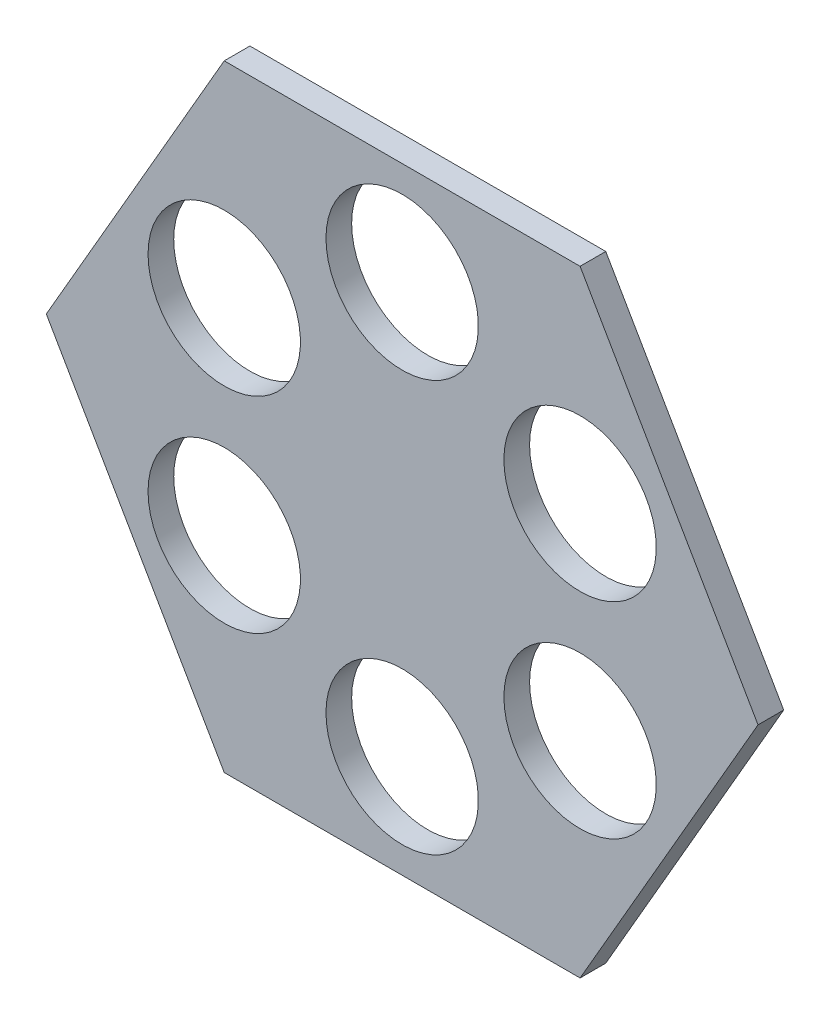
ISO-10303-21;
HEADER;
FILE_DESCRIPTION(('STEP AP214'),'2;1');
FILE_NAME('part.step','',(''),(''),'','','');
FILE_SCHEMA(('AUTOMOTIVE_DESIGN { 1 0 10303 214 1 1 1 1 }'));
ENDSEC;
DATA;
#1=APPLICATION_CONTEXT('core data for automotive mechanical design processes');
#2=APPLICATION_PROTOCOL_DEFINITION('international standard','automotive_design',2000,#1);
#3=PRODUCT_CONTEXT('',#1,'mechanical');
#4=PRODUCT('Part','Part','',(#3));
#5=PRODUCT_RELATED_PRODUCT_CATEGORY('part','',(#4));
#6=PRODUCT_DEFINITION_FORMATION('','',#4);
#7=PRODUCT_DEFINITION_CONTEXT('part definition',#1,'design');
#8=PRODUCT_DEFINITION('design','',#6,#7);
#9=PRODUCT_DEFINITION_SHAPE('','',#8);
#10=(LENGTH_UNIT() NAMED_UNIT(*) SI_UNIT(.MILLI.,.METRE.));
#11=(NAMED_UNIT(*) PLANE_ANGLE_UNIT() SI_UNIT($,.RADIAN.));
#12=(NAMED_UNIT(*) SI_UNIT($,.STERADIAN.) SOLID_ANGLE_UNIT());
#13=UNCERTAINTY_MEASURE_WITH_UNIT(LENGTH_MEASURE(1.E-05),#10,'distance_accuracy_value','');
#14=(GEOMETRIC_REPRESENTATION_CONTEXT(3) GLOBAL_UNCERTAINTY_ASSIGNED_CONTEXT((#13)) GLOBAL_UNIT_ASSIGNED_CONTEXT((#10,
#11,#12)) REPRESENTATION_CONTEXT('',''));
#15=CARTESIAN_POINT('',(0.,0.,0.));
#16=DIRECTION('',(0.,0.,1.));
#17=DIRECTION('',(1.,0.,0.));
#18=AXIS2_PLACEMENT_3D('',#15,#16,#17);
#19=CARTESIAN_POINT('',(-197.973407305123,114.3,19.05));
#20=DIRECTION('',(-0.866025403784439,0.499999999999999,0.));
#21=DIRECTION('',(-0.499999999999999,-0.866025403784439,0.));
#22=AXIS2_PLACEMENT_3D('',#19,#20,#21);
#23=PLANE('',#22);
#24=DIRECTION('',(0.499999999999999,0.866025403784439,0.));
#25=VECTOR('',#24,1.);
#26=CARTESIAN_POINT('',(-197.973407305123,114.3,0.));
#27=LINE('',#26,#25);
#28=CARTESIAN_POINT('',(-263.964543073497,-7.35522753814166E-13,0.));
#29=VERTEX_POINT('',#28);
#30=CARTESIAN_POINT('',(-131.982271536748,228.6,0.));
#31=VERTEX_POINT('',#30);
#32=EDGE_CURVE('E136',#29,#31,#27,.T.);
#33=ORIENTED_EDGE('',*,*,#32,.F.);
#34=DIRECTION('',(0.,0.,-1.));
#35=VECTOR('',#34,1.);
#36=CARTESIAN_POINT('',(-263.964543073497,-7.35522753814166E-13,19.05));
#37=LINE('',#36,#35);
#38=CARTESIAN_POINT('',(-263.964543073497,-7.35522753814166E-13,19.05));
#39=VERTEX_POINT('',#38);
#40=EDGE_CURVE('E11',#39,#29,#37,.T.);
#41=ORIENTED_EDGE('',*,*,#40,.F.);
#42=DIRECTION('',(0.499999999999999,0.866025403784439,0.));
#43=VECTOR('',#42,1.);
#44=CARTESIAN_POINT('',(-197.973407305123,114.3,19.05));
#45=LINE('',#44,#43);
#46=CARTESIAN_POINT('',(-131.982271536748,228.6,19.05));
#47=VERTEX_POINT('',#46);
#48=EDGE_CURVE('E248',#39,#47,#45,.T.);
#49=ORIENTED_EDGE('',*,*,#48,.T.);
#50=DIRECTION('',(0.,0.,-1.));
#51=VECTOR('',#50,1.);
#52=CARTESIAN_POINT('',(-131.982271536748,228.6,19.05));
#53=LINE('',#52,#51);
#54=EDGE_CURVE('E52',#47,#31,#53,.T.);
#55=ORIENTED_EDGE('',*,*,#54,.T.);
#56=EDGE_LOOP('',(#33,#41,#49,#55));
#57=FACE_BOUND('',#56,.T.);
#58=ADVANCED_FACE('F35',(#57),#23,.T.);
#59=CARTESIAN_POINT('',(-197.973407305123,-114.3,19.05));
#60=DIRECTION('',(-0.866025403784438,-0.5,0.));
#61=DIRECTION('',(0.5,-0.866025403784438,0.));
#62=AXIS2_PLACEMENT_3D('',#59,#60,#61);
#63=PLANE('',#62);
#64=DIRECTION('',(-0.5,0.866025403784438,0.));
#65=VECTOR('',#64,1.);
#66=CARTESIAN_POINT('',(-197.973407305123,-114.3,0.));
#67=LINE('',#66,#65);
#68=CARTESIAN_POINT('',(-131.982271536748,-228.6,0.));
#69=VERTEX_POINT('',#68);
#70=EDGE_CURVE('E138',#69,#29,#67,.T.);
#71=ORIENTED_EDGE('',*,*,#70,.F.);
#72=DIRECTION('',(0.,0.,-1.));
#73=VECTOR('',#72,1.);
#74=CARTESIAN_POINT('',(-131.982271536748,-228.6,19.05));
#75=LINE('',#74,#73);
#76=CARTESIAN_POINT('',(-131.982271536748,-228.6,19.05));
#77=VERTEX_POINT('',#76);
#78=EDGE_CURVE('E44',#77,#69,#75,.T.);
#79=ORIENTED_EDGE('',*,*,#78,.F.);
#80=DIRECTION('',(-0.5,0.866025403784438,0.));
#81=VECTOR('',#80,1.);
#82=CARTESIAN_POINT('',(-197.973407305123,-114.3,19.05));
#83=LINE('',#82,#81);
#84=EDGE_CURVE('E250',#77,#39,#83,.T.);
#85=ORIENTED_EDGE('',*,*,#84,.T.);
#86=ORIENTED_EDGE('',*,*,#40,.T.);
#87=EDGE_LOOP('',(#71,#79,#85,#86));
#88=FACE_BOUND('',#87,.T.);
#89=ADVANCED_FACE('F174',(#88),#63,.T.);
#90=CARTESIAN_POINT('',(0.,-228.6,19.05));
#91=DIRECTION('',(0.,-1.,0.));
#92=DIRECTION('',(0.,0.,-1.));
#93=AXIS2_PLACEMENT_3D('',#90,#91,#92);
#94=PLANE('',#93);
#95=DIRECTION('',(-1.,0.,0.));
#96=VECTOR('',#95,1.);
#97=CARTESIAN_POINT('',(0.,-228.6,0.));
#98=LINE('',#97,#96);
#99=CARTESIAN_POINT('',(131.982271536749,-228.599999999999,0.));
#100=VERTEX_POINT('',#99);
#101=EDGE_CURVE('E141',#100,#69,#98,.T.);
#102=ORIENTED_EDGE('',*,*,#101,.F.);
#103=DIRECTION('',(0.,0.,-1.));
#104=VECTOR('',#103,1.);
#105=CARTESIAN_POINT('',(131.982271536749,-228.599999999999,19.05));
#106=LINE('',#105,#104);
#107=CARTESIAN_POINT('',(131.982271536749,-228.599999999999,19.05));
#108=VERTEX_POINT('',#107);
#109=EDGE_CURVE('E99',#108,#100,#106,.T.);
#110=ORIENTED_EDGE('',*,*,#109,.F.);
#111=DIRECTION('',(-1.,0.,0.));
#112=VECTOR('',#111,1.);
#113=CARTESIAN_POINT('',(0.,-228.6,19.05));
#114=LINE('',#113,#112);
#115=EDGE_CURVE('E110',#108,#77,#114,.T.);
#116=ORIENTED_EDGE('',*,*,#115,.T.);
#117=ORIENTED_EDGE('',*,*,#78,.T.);
#118=EDGE_LOOP('',(#102,#110,#116,#117));
#119=FACE_BOUND('',#118,.T.);
#120=ADVANCED_FACE('F171',(#119),#94,.T.);
#121=CARTESIAN_POINT('',(197.973407305123,-114.3,19.05));
#122=DIRECTION('',(0.866025403784439,-0.5,0.));
#123=DIRECTION('',(0.5,0.866025403784439,0.));
#124=AXIS2_PLACEMENT_3D('',#121,#122,#123);
#125=PLANE('',#124);
#126=DIRECTION('',(-0.5,-0.866025403784439,0.));
#127=VECTOR('',#126,1.);
#128=CARTESIAN_POINT('',(197.973407305123,-114.3,0.));
#129=LINE('',#128,#127);
#130=CARTESIAN_POINT('',(263.964543073497,6.10622663543836E-13,0.));
#131=VERTEX_POINT('',#130);
#132=EDGE_CURVE('E95',#131,#100,#129,.T.);
#133=ORIENTED_EDGE('',*,*,#132,.F.);
#134=DIRECTION('',(0.,0.,-1.));
#135=VECTOR('',#134,1.);
#136=CARTESIAN_POINT('',(263.964543073497,6.10622663543836E-13,19.05));
#137=LINE('',#136,#135);
#138=CARTESIAN_POINT('',(263.964543073497,6.10622663543836E-13,19.05));
#139=VERTEX_POINT('',#138);
#140=EDGE_CURVE('E90',#139,#131,#137,.T.);
#141=ORIENTED_EDGE('',*,*,#140,.F.);
#142=DIRECTION('',(-0.5,-0.866025403784439,0.));
#143=VECTOR('',#142,1.);
#144=CARTESIAN_POINT('',(197.973407305123,-114.3,19.05));
#145=LINE('',#144,#143);
#146=EDGE_CURVE('E93',#139,#108,#145,.T.);
#147=ORIENTED_EDGE('',*,*,#146,.T.);
#148=ORIENTED_EDGE('',*,*,#109,.T.);
#149=EDGE_LOOP('',(#133,#141,#147,#148));
#150=FACE_BOUND('',#149,.T.);
#151=ADVANCED_FACE('F92',(#150),#125,.T.);
#152=CARTESIAN_POINT('',(197.973407305123,114.3,19.05));
#153=DIRECTION('',(0.866025403784439,0.5,0.));
#154=DIRECTION('',(-0.5,0.866025403784438,0.));
#155=AXIS2_PLACEMENT_3D('',#152,#153,#154);
#156=PLANE('',#155);
#157=DIRECTION('',(0.5,-0.866025403784439,0.));
#158=VECTOR('',#157,1.);
#159=CARTESIAN_POINT('',(197.973407305123,114.3,0.));
#160=LINE('',#159,#158);
#161=CARTESIAN_POINT('',(131.982271536748,228.6,0.));
#162=VERTEX_POINT('',#161);
#163=EDGE_CURVE('E145',#162,#131,#160,.T.);
#164=ORIENTED_EDGE('',*,*,#163,.F.);
#165=DIRECTION('',(0.,0.,-1.));
#166=VECTOR('',#165,1.);
#167=CARTESIAN_POINT('',(131.982271536748,228.6,19.05));
#168=LINE('',#167,#166);
#169=CARTESIAN_POINT('',(131.982271536748,228.6,19.05));
#170=VERTEX_POINT('',#169);
#171=EDGE_CURVE('E71',#170,#162,#168,.T.);
#172=ORIENTED_EDGE('',*,*,#171,.F.);
#173=DIRECTION('',(0.5,-0.866025403784439,0.));
#174=VECTOR('',#173,1.);
#175=CARTESIAN_POINT('',(197.973407305123,114.3,19.05));
#176=LINE('',#175,#174);
#177=EDGE_CURVE('E107',#170,#139,#176,.T.);
#178=ORIENTED_EDGE('',*,*,#177,.T.);
#179=ORIENTED_EDGE('',*,*,#140,.T.);
#180=EDGE_LOOP('',(#164,#172,#178,#179));
#181=FACE_BOUND('',#180,.T.);
#182=ADVANCED_FACE('F112',(#181),#156,.T.);
#183=CARTESIAN_POINT('',(0.,-152.4,19.05));
#184=DIRECTION('',(0.,0.,-1.));
#185=DIRECTION('',(-1.,0.,0.));
#186=AXIS2_PLACEMENT_3D('',#183,#184,#185);
#187=CYLINDRICAL_SURFACE('',#186,56.515);
#188=CARTESIAN_POINT('',(0.,-152.4,19.05));
#189=DIRECTION('',(0.,0.,1.));
#190=DIRECTION('',(1.,0.,0.));
#191=AXIS2_PLACEMENT_3D('',#188,#189,#190);
#192=CIRCLE('',#191,56.515);
#193=CARTESIAN_POINT('',(-56.515,-152.4,19.05));
#194=VERTEX_POINT('',#193);
#195=EDGE_CURVE('E127',#194,#194,#192,.T.);
#196=CARTESIAN_POINT('',(0.,-152.4,0.));
#197=DIRECTION('',(0.,0.,1.));
#198=DIRECTION('',(1.,0.,0.));
#199=AXIS2_PLACEMENT_3D('',#196,#197,#198);
#200=CIRCLE('',#199,56.515);
#201=CARTESIAN_POINT('',(-56.515,-152.4,0.));
#202=VERTEX_POINT('',#201);
#203=EDGE_CURVE('E159',#202,#202,#200,.T.);
#204=CARTESIAN_POINT('',(-56.515,-152.4,19.05));
#205=CARTESIAN_POINT('',(-56.515,-152.4,18.8515625));
#206=CARTESIAN_POINT('',(-56.515,-152.4,18.653125));
#207=CARTESIAN_POINT('',(-56.515,-152.4,18.25625));
#208=CARTESIAN_POINT('',(-56.515,-152.4,18.0578125));
#209=CARTESIAN_POINT('',(-56.515,-152.4,17.6609375));
#210=CARTESIAN_POINT('',(-56.515,-152.4,17.4625));
#211=CARTESIAN_POINT('',(-56.515,-152.4,17.065625));
#212=CARTESIAN_POINT('',(-56.515,-152.4,16.8671875));
#213=CARTESIAN_POINT('',(-56.515,-152.4,16.4703125));
#214=CARTESIAN_POINT('',(-56.515,-152.4,16.271875));
#215=CARTESIAN_POINT('',(-56.515,-152.4,15.875));
#216=CARTESIAN_POINT('',(-56.515,-152.4,15.6765625));
#217=CARTESIAN_POINT('',(-56.515,-152.4,15.2796875));
#218=CARTESIAN_POINT('',(-56.515,-152.4,15.08125));
#219=CARTESIAN_POINT('',(-56.515,-152.4,14.684375));
#220=CARTESIAN_POINT('',(-56.515,-152.4,14.4859375));
#221=CARTESIAN_POINT('',(-56.515,-152.4,14.0890625));
#222=CARTESIAN_POINT('',(-56.515,-152.4,13.890625));
#223=CARTESIAN_POINT('',(-56.515,-152.4,13.49375));
#224=CARTESIAN_POINT('',(-56.515,-152.4,13.2953125));
#225=CARTESIAN_POINT('',(-56.515,-152.4,12.8984375));
#226=CARTESIAN_POINT('',(-56.515,-152.4,12.7));
#227=CARTESIAN_POINT('',(-56.515,-152.4,12.303125));
#228=CARTESIAN_POINT('',(-56.515,-152.4,12.1046875));
#229=CARTESIAN_POINT('',(-56.515,-152.4,11.7078125));
#230=CARTESIAN_POINT('',(-56.515,-152.4,11.509375));
#231=CARTESIAN_POINT('',(-56.515,-152.4,11.1125));
#232=CARTESIAN_POINT('',(-56.515,-152.4,10.9140625));
#233=CARTESIAN_POINT('',(-56.515,-152.4,10.5171875));
#234=CARTESIAN_POINT('',(-56.515,-152.4,10.31875));
#235=CARTESIAN_POINT('',(-56.515,-152.4,9.921875));
#236=CARTESIAN_POINT('',(-56.515,-152.4,9.7234375));
#237=CARTESIAN_POINT('',(-56.515,-152.4,9.3265625));
#238=CARTESIAN_POINT('',(-56.515,-152.4,9.128125));
#239=CARTESIAN_POINT('',(-56.515,-152.4,8.73125));
#240=CARTESIAN_POINT('',(-56.515,-152.4,8.5328125));
#241=CARTESIAN_POINT('',(-56.515,-152.4,8.1359375));
#242=CARTESIAN_POINT('',(-56.515,-152.4,7.9375));
#243=CARTESIAN_POINT('',(-56.515,-152.4,7.540625));
#244=CARTESIAN_POINT('',(-56.515,-152.4,7.3421875));
#245=CARTESIAN_POINT('',(-56.515,-152.4,6.9453125));
#246=CARTESIAN_POINT('',(-56.515,-152.4,6.746875));
#247=CARTESIAN_POINT('',(-56.515,-152.4,6.35));
#248=CARTESIAN_POINT('',(-56.515,-152.4,6.1515625));
#249=CARTESIAN_POINT('',(-56.515,-152.4,5.7546875));
#250=CARTESIAN_POINT('',(-56.515,-152.4,5.55625));
#251=CARTESIAN_POINT('',(-56.515,-152.4,5.159375));
#252=CARTESIAN_POINT('',(-56.515,-152.4,4.9609375));
#253=CARTESIAN_POINT('',(-56.515,-152.4,4.5640625));
#254=CARTESIAN_POINT('',(-56.515,-152.4,4.365625));
#255=CARTESIAN_POINT('',(-56.515,-152.4,3.96875));
#256=CARTESIAN_POINT('',(-56.515,-152.4,3.7703125));
#257=CARTESIAN_POINT('',(-56.515,-152.4,3.3734375));
#258=CARTESIAN_POINT('',(-56.515,-152.4,3.175));
#259=CARTESIAN_POINT('',(-56.515,-152.4,2.778125));
#260=CARTESIAN_POINT('',(-56.515,-152.4,2.5796875));
#261=CARTESIAN_POINT('',(-56.515,-152.4,2.1828125));
#262=CARTESIAN_POINT('',(-56.515,-152.4,1.984375));
#263=CARTESIAN_POINT('',(-56.515,-152.4,1.5875));
#264=CARTESIAN_POINT('',(-56.515,-152.4,1.3890625));
#265=CARTESIAN_POINT('',(-56.515,-152.4,0.992187500000001));
#266=CARTESIAN_POINT('',(-56.515,-152.4,0.793750000000001));
#267=CARTESIAN_POINT('',(-56.515,-152.4,0.396875));
#268=CARTESIAN_POINT('',(-56.515,-152.4,0.1984375));
#269=CARTESIAN_POINT('',(-56.515,-152.4,0.));
#270=B_SPLINE_CURVE_WITH_KNOTS('',3,(#204,#205,#206,#207,#208,#209,#210,#211,#212,#213,#214,
#215,#216,#217,#218,#219,#220,#221,#222,#223,#224,#225,#226,#227,#228,#229,#230,#231,#232,#233,
#234,#235,#236,#237,#238,#239,#240,#241,#242,#243,#244,#245,#246,#247,#248,#249,#250,#251,#252,
#253,#254,#255,#256,#257,#258,#259,#260,#261,#262,#263,#264,#265,#266,#267,#268,#269),
.UNSPECIFIED.,.F.,.F.,(4,2,2,2,2,2,2,2,2,2,2,2,2,2,2,2,2,2,2,2,2,2,2,2,2,2,2,2,2,2,2,2,4),(0.,
0.5953125,1.190625,1.7859375,2.38125,2.9765625,3.571875,4.1671875,4.7625,5.3578125,5.953125,
6.5484375,7.14375,7.7390625,8.334375,8.9296875,9.525,10.1203125,10.715625,11.3109375,11.90625,
12.5015625,13.096875,13.6921875,14.2875,14.8828125,15.478125,16.0734375,16.66875,17.2640625,
17.859375,18.4546875,19.05),.UNSPECIFIED.);
#271=EDGE_CURVE('BSEAM202',#194,#202,#270,.T.);
#272=ORIENTED_EDGE('',*,*,#195,.T.);
#273=ORIENTED_EDGE('',*,*,#203,.F.);
#274=ORIENTED_EDGE('',*,*,#271,.T.);
#275=ORIENTED_EDGE('',*,*,#271,.F.);
#276=EDGE_LOOP('',(#272,#274,#273,#275));
#277=FACE_BOUND('',#276,.T.);
#278=ADVANCED_FACE('F202',(#277),#187,.F.);
#279=CARTESIAN_POINT('',(131.982271536748,76.2,19.05));
#280=DIRECTION('',(0.,0.,-1.));
#281=DIRECTION('',(-1.,0.,0.));
#282=AXIS2_PLACEMENT_3D('',#279,#280,#281);
#283=CYLINDRICAL_SURFACE('',#282,56.515);
#284=CARTESIAN_POINT('',(131.982271536748,76.2,19.05));
#285=DIRECTION('',(0.,0.,1.));
#286=DIRECTION('',(1.,0.,0.));
#287=AXIS2_PLACEMENT_3D('',#284,#285,#286);
#288=CIRCLE('',#287,56.515);
#289=CARTESIAN_POINT('',(75.4672715367484,76.2,19.05));
#290=VERTEX_POINT('',#289);
#291=EDGE_CURVE('E124',#290,#290,#288,.T.);
#292=CARTESIAN_POINT('',(131.982271536748,76.2,0.));
#293=DIRECTION('',(0.,0.,1.));
#294=DIRECTION('',(1.,0.,0.));
#295=AXIS2_PLACEMENT_3D('',#292,#293,#294);
#296=CIRCLE('',#295,56.515);
#297=CARTESIAN_POINT('',(75.4672715367484,76.2,0.));
#298=VERTEX_POINT('',#297);
#299=EDGE_CURVE('E156',#298,#298,#296,.T.);
#300=CARTESIAN_POINT('',(75.4672715367484,76.2,19.05));
#301=CARTESIAN_POINT('',(75.4672715367484,76.2,18.8515625));
#302=CARTESIAN_POINT('',(75.4672715367484,76.2,18.653125));
#303=CARTESIAN_POINT('',(75.4672715367484,76.2,18.25625));
#304=CARTESIAN_POINT('',(75.4672715367484,76.2,18.0578125));
#305=CARTESIAN_POINT('',(75.4672715367484,76.2,17.6609375));
#306=CARTESIAN_POINT('',(75.4672715367484,76.2,17.4625));
#307=CARTESIAN_POINT('',(75.4672715367484,76.2,17.065625));
#308=CARTESIAN_POINT('',(75.4672715367484,76.2,16.8671875));
#309=CARTESIAN_POINT('',(75.4672715367484,76.2,16.4703125));
#310=CARTESIAN_POINT('',(75.4672715367484,76.2,16.271875));
#311=CARTESIAN_POINT('',(75.4672715367484,76.2,15.875));
#312=CARTESIAN_POINT('',(75.4672715367484,76.2,15.6765625));
#313=CARTESIAN_POINT('',(75.4672715367484,76.2,15.2796875));
#314=CARTESIAN_POINT('',(75.4672715367484,76.2,15.08125));
#315=CARTESIAN_POINT('',(75.4672715367484,76.2,14.684375));
#316=CARTESIAN_POINT('',(75.4672715367484,76.2,14.4859375));
#317=CARTESIAN_POINT('',(75.4672715367484,76.2,14.0890625));
#318=CARTESIAN_POINT('',(75.4672715367484,76.2,13.890625));
#319=CARTESIAN_POINT('',(75.4672715367484,76.2,13.49375));
#320=CARTESIAN_POINT('',(75.4672715367484,76.2,13.2953125));
#321=CARTESIAN_POINT('',(75.4672715367484,76.2,12.8984375));
#322=CARTESIAN_POINT('',(75.4672715367484,76.2,12.7));
#323=CARTESIAN_POINT('',(75.4672715367484,76.2,12.303125));
#324=CARTESIAN_POINT('',(75.4672715367484,76.2,12.1046875));
#325=CARTESIAN_POINT('',(75.4672715367484,76.2,11.7078125));
#326=CARTESIAN_POINT('',(75.4672715367484,76.2,11.509375));
#327=CARTESIAN_POINT('',(75.4672715367484,76.2,11.1125));
#328=CARTESIAN_POINT('',(75.4672715367484,76.2,10.9140625));
#329=CARTESIAN_POINT('',(75.4672715367484,76.2,10.5171875));
#330=CARTESIAN_POINT('',(75.4672715367484,76.2,10.31875));
#331=CARTESIAN_POINT('',(75.4672715367484,76.2,9.921875));
#332=CARTESIAN_POINT('',(75.4672715367484,76.2,9.7234375));
#333=CARTESIAN_POINT('',(75.4672715367484,76.2,9.3265625));
#334=CARTESIAN_POINT('',(75.4672715367484,76.2,9.128125));
#335=CARTESIAN_POINT('',(75.4672715367484,76.2,8.73125));
#336=CARTESIAN_POINT('',(75.4672715367484,76.2,8.5328125));
#337=CARTESIAN_POINT('',(75.4672715367484,76.2,8.1359375));
#338=CARTESIAN_POINT('',(75.4672715367484,76.2,7.9375));
#339=CARTESIAN_POINT('',(75.4672715367484,76.2,7.540625));
#340=CARTESIAN_POINT('',(75.4672715367484,76.2,7.3421875));
#341=CARTESIAN_POINT('',(75.4672715367484,76.2,6.9453125));
#342=CARTESIAN_POINT('',(75.4672715367484,76.2,6.746875));
#343=CARTESIAN_POINT('',(75.4672715367484,76.2,6.35));
#344=CARTESIAN_POINT('',(75.4672715367484,76.2,6.1515625));
#345=CARTESIAN_POINT('',(75.4672715367484,76.2,5.7546875));
#346=CARTESIAN_POINT('',(75.4672715367484,76.2,5.55625));
#347=CARTESIAN_POINT('',(75.4672715367484,76.2,5.159375));
#348=CARTESIAN_POINT('',(75.4672715367484,76.2,4.9609375));
#349=CARTESIAN_POINT('',(75.4672715367484,76.2,4.5640625));
#350=CARTESIAN_POINT('',(75.4672715367484,76.2,4.365625));
#351=CARTESIAN_POINT('',(75.4672715367484,76.2,3.96875));
#352=CARTESIAN_POINT('',(75.4672715367484,76.2,3.7703125));
#353=CARTESIAN_POINT('',(75.4672715367484,76.2,3.3734375));
#354=CARTESIAN_POINT('',(75.4672715367484,76.2,3.175));
#355=CARTESIAN_POINT('',(75.4672715367484,76.2,2.778125));
#356=CARTESIAN_POINT('',(75.4672715367484,76.2,2.5796875));
#357=CARTESIAN_POINT('',(75.4672715367484,76.2,2.1828125));
#358=CARTESIAN_POINT('',(75.4672715367484,76.2,1.984375));
#359=CARTESIAN_POINT('',(75.4672715367484,76.2,1.5875));
#360=CARTESIAN_POINT('',(75.4672715367484,76.2,1.3890625));
#361=CARTESIAN_POINT('',(75.4672715367484,76.2,0.992187500000001));
#362=CARTESIAN_POINT('',(75.4672715367484,76.2,0.793750000000001));
#363=CARTESIAN_POINT('',(75.4672715367484,76.2,0.396875));
#364=CARTESIAN_POINT('',(75.4672715367484,76.2,0.1984375));
#365=CARTESIAN_POINT('',(75.4672715367484,76.2,0.));
#366=B_SPLINE_CURVE_WITH_KNOTS('',3,(#300,#301,#302,#303,#304,#305,#306,#307,#308,#309,#310,
#311,#312,#313,#314,#315,#316,#317,#318,#319,#320,#321,#322,#323,#324,#325,#326,#327,#328,#329,
#330,#331,#332,#333,#334,#335,#336,#337,#338,#339,#340,#341,#342,#343,#344,#345,#346,#347,#348,
#349,#350,#351,#352,#353,#354,#355,#356,#357,#358,#359,#360,#361,#362,#363,#364,#365),
.UNSPECIFIED.,.F.,.F.,(4,2,2,2,2,2,2,2,2,2,2,2,2,2,2,2,2,2,2,2,2,2,2,2,2,2,2,2,2,2,2,2,4),(0.,
0.5953125,1.190625,1.7859375,2.38125,2.9765625,3.571875,4.1671875,4.7625,5.3578125,5.953125,
6.5484375,7.14375,7.7390625,8.334375,8.9296875,9.525,10.1203125,10.715625,11.3109375,11.90625,
12.5015625,13.096875,13.6921875,14.2875,14.8828125,15.478125,16.0734375,16.66875,17.2640625,
17.859375,18.4546875,19.05),.UNSPECIFIED.);
#367=EDGE_CURVE('BSEAM206',#290,#298,#366,.T.);
#368=ORIENTED_EDGE('',*,*,#291,.T.);
#369=ORIENTED_EDGE('',*,*,#299,.F.);
#370=ORIENTED_EDGE('',*,*,#367,.T.);
#371=ORIENTED_EDGE('',*,*,#367,.F.);
#372=EDGE_LOOP('',(#368,#370,#369,#371));
#373=FACE_BOUND('',#372,.T.);
#374=ADVANCED_FACE('F206',(#373),#283,.F.);
#375=CARTESIAN_POINT('',(-131.982271536748,-76.2000000000001,19.05));
#376=DIRECTION('',(0.,0.,-1.));
#377=DIRECTION('',(-1.,0.,0.));
#378=AXIS2_PLACEMENT_3D('',#375,#376,#377);
#379=CYLINDRICAL_SURFACE('',#378,56.515);
#380=CARTESIAN_POINT('',(-131.982271536748,-76.2000000000001,19.05));
#381=DIRECTION('',(0.,0.,1.));
#382=DIRECTION('',(1.,0.,0.));
#383=AXIS2_PLACEMENT_3D('',#380,#381,#382);
#384=CIRCLE('',#383,56.515);
#385=CARTESIAN_POINT('',(-188.497271536748,-76.2000000000001,19.05));
#386=VERTEX_POINT('',#385);
#387=EDGE_CURVE('E121',#386,#386,#384,.T.);
#388=CARTESIAN_POINT('',(-131.982271536748,-76.2000000000001,0.));
#389=DIRECTION('',(0.,0.,1.));
#390=DIRECTION('',(1.,0.,0.));
#391=AXIS2_PLACEMENT_3D('',#388,#389,#390);
#392=CIRCLE('',#391,56.515);
#393=CARTESIAN_POINT('',(-188.497271536748,-76.2000000000001,0.));
#394=VERTEX_POINT('',#393);
#395=EDGE_CURVE('E153',#394,#394,#392,.T.);
#396=CARTESIAN_POINT('',(-188.497271536748,-76.2000000000001,19.05));
#397=CARTESIAN_POINT('',(-188.497271536748,-76.2000000000001,18.8515625));
#398=CARTESIAN_POINT('',(-188.497271536748,-76.2000000000001,18.653125));
#399=CARTESIAN_POINT('',(-188.497271536748,-76.2000000000001,18.25625));
#400=CARTESIAN_POINT('',(-188.497271536748,-76.2000000000001,18.0578125));
#401=CARTESIAN_POINT('',(-188.497271536748,-76.2000000000001,17.6609375));
#402=CARTESIAN_POINT('',(-188.497271536748,-76.2000000000001,17.4625));
#403=CARTESIAN_POINT('',(-188.497271536748,-76.2000000000001,17.065625));
#404=CARTESIAN_POINT('',(-188.497271536748,-76.2000000000001,16.8671875));
#405=CARTESIAN_POINT('',(-188.497271536748,-76.2000000000001,16.4703125));
#406=CARTESIAN_POINT('',(-188.497271536748,-76.2000000000001,16.271875));
#407=CARTESIAN_POINT('',(-188.497271536748,-76.2000000000001,15.875));
#408=CARTESIAN_POINT('',(-188.497271536748,-76.2000000000001,15.6765625));
#409=CARTESIAN_POINT('',(-188.497271536748,-76.2000000000001,15.2796875));
#410=CARTESIAN_POINT('',(-188.497271536748,-76.2000000000001,15.08125));
#411=CARTESIAN_POINT('',(-188.497271536748,-76.2000000000001,14.684375));
#412=CARTESIAN_POINT('',(-188.497271536748,-76.2000000000001,14.4859375));
#413=CARTESIAN_POINT('',(-188.497271536748,-76.2000000000001,14.0890625));
#414=CARTESIAN_POINT('',(-188.497271536748,-76.2000000000001,13.890625));
#415=CARTESIAN_POINT('',(-188.497271536748,-76.2000000000001,13.49375));
#416=CARTESIAN_POINT('',(-188.497271536748,-76.2000000000001,13.2953125));
#417=CARTESIAN_POINT('',(-188.497271536748,-76.2000000000001,12.8984375));
#418=CARTESIAN_POINT('',(-188.497271536748,-76.2000000000001,12.7));
#419=CARTESIAN_POINT('',(-188.497271536748,-76.2000000000001,12.303125));
#420=CARTESIAN_POINT('',(-188.497271536748,-76.2000000000001,12.1046875));
#421=CARTESIAN_POINT('',(-188.497271536748,-76.2000000000001,11.7078125));
#422=CARTESIAN_POINT('',(-188.497271536748,-76.2000000000001,11.509375));
#423=CARTESIAN_POINT('',(-188.497271536748,-76.2000000000001,11.1125));
#424=CARTESIAN_POINT('',(-188.497271536748,-76.2000000000001,10.9140625));
#425=CARTESIAN_POINT('',(-188.497271536748,-76.2000000000001,10.5171875));
#426=CARTESIAN_POINT('',(-188.497271536748,-76.2000000000001,10.31875));
#427=CARTESIAN_POINT('',(-188.497271536748,-76.2000000000001,9.921875));
#428=CARTESIAN_POINT('',(-188.497271536748,-76.2000000000001,9.7234375));
#429=CARTESIAN_POINT('',(-188.497271536748,-76.2000000000001,9.3265625));
#430=CARTESIAN_POINT('',(-188.497271536748,-76.2000000000001,9.128125));
#431=CARTESIAN_POINT('',(-188.497271536748,-76.2000000000001,8.73125));
#432=CARTESIAN_POINT('',(-188.497271536748,-76.2000000000001,8.5328125));
#433=CARTESIAN_POINT('',(-188.497271536748,-76.2000000000001,8.1359375));
#434=CARTESIAN_POINT('',(-188.497271536748,-76.2000000000001,7.9375));
#435=CARTESIAN_POINT('',(-188.497271536748,-76.2000000000001,7.540625));
#436=CARTESIAN_POINT('',(-188.497271536748,-76.2000000000001,7.3421875));
#437=CARTESIAN_POINT('',(-188.497271536748,-76.2000000000001,6.9453125));
#438=CARTESIAN_POINT('',(-188.497271536748,-76.2000000000001,6.746875));
#439=CARTESIAN_POINT('',(-188.497271536748,-76.2000000000001,6.35));
#440=CARTESIAN_POINT('',(-188.497271536748,-76.2000000000001,6.1515625));
#441=CARTESIAN_POINT('',(-188.497271536748,-76.2000000000001,5.7546875));
#442=CARTESIAN_POINT('',(-188.497271536748,-76.2000000000001,5.55625));
#443=CARTESIAN_POINT('',(-188.497271536748,-76.2000000000001,5.159375));
#444=CARTESIAN_POINT('',(-188.497271536748,-76.2000000000001,4.9609375));
#445=CARTESIAN_POINT('',(-188.497271536748,-76.2000000000001,4.5640625));
#446=CARTESIAN_POINT('',(-188.497271536748,-76.2000000000001,4.365625));
#447=CARTESIAN_POINT('',(-188.497271536748,-76.2000000000001,3.96875));
#448=CARTESIAN_POINT('',(-188.497271536748,-76.2000000000001,3.7703125));
#449=CARTESIAN_POINT('',(-188.497271536748,-76.2000000000001,3.3734375));
#450=CARTESIAN_POINT('',(-188.497271536748,-76.2000000000001,3.175));
#451=CARTESIAN_POINT('',(-188.497271536748,-76.2000000000001,2.778125));
#452=CARTESIAN_POINT('',(-188.497271536748,-76.2000000000001,2.5796875));
#453=CARTESIAN_POINT('',(-188.497271536748,-76.2000000000001,2.1828125));
#454=CARTESIAN_POINT('',(-188.497271536748,-76.2000000000001,1.984375));
#455=CARTESIAN_POINT('',(-188.497271536748,-76.2000000000001,1.5875));
#456=CARTESIAN_POINT('',(-188.497271536748,-76.2000000000001,1.3890625));
#457=CARTESIAN_POINT('',(-188.497271536748,-76.2000000000001,0.992187500000001));
#458=CARTESIAN_POINT('',(-188.497271536748,-76.2000000000001,0.793750000000001));
#459=CARTESIAN_POINT('',(-188.497271536748,-76.2000000000001,0.396875));
#460=CARTESIAN_POINT('',(-188.497271536748,-76.2000000000001,0.1984375));
#461=CARTESIAN_POINT('',(-188.497271536748,-76.2000000000001,0.));
#462=B_SPLINE_CURVE_WITH_KNOTS('',3,(#396,#397,#398,#399,#400,#401,#402,#403,#404,#405,#406,
#407,#408,#409,#410,#411,#412,#413,#414,#415,#416,#417,#418,#419,#420,#421,#422,#423,#424,#425,
#426,#427,#428,#429,#430,#431,#432,#433,#434,#435,#436,#437,#438,#439,#440,#441,#442,#443,#444,
#445,#446,#447,#448,#449,#450,#451,#452,#453,#454,#455,#456,#457,#458,#459,#460,#461),
.UNSPECIFIED.,.F.,.F.,(4,2,2,2,2,2,2,2,2,2,2,2,2,2,2,2,2,2,2,2,2,2,2,2,2,2,2,2,2,2,2,2,4),(0.,
0.5953125,1.190625,1.7859375,2.38125,2.9765625,3.571875,4.1671875,4.7625,5.3578125,5.953125,
6.5484375,7.14375,7.7390625,8.334375,8.9296875,9.525,10.1203125,10.715625,11.3109375,11.90625,
12.5015625,13.096875,13.6921875,14.2875,14.8828125,15.478125,16.0734375,16.66875,17.2640625,
17.859375,18.4546875,19.05),.UNSPECIFIED.);
#463=EDGE_CURVE('BSEAM188',#386,#394,#462,.T.);
#464=ORIENTED_EDGE('',*,*,#387,.T.);
#465=ORIENTED_EDGE('',*,*,#395,.F.);
#466=ORIENTED_EDGE('',*,*,#463,.T.);
#467=ORIENTED_EDGE('',*,*,#463,.F.);
#468=EDGE_LOOP('',(#464,#466,#465,#467));
#469=FACE_BOUND('',#468,.T.);
#470=ADVANCED_FACE('F188',(#469),#379,.F.);
#471=CARTESIAN_POINT('',(0.,152.4,19.05));
#472=DIRECTION('',(0.,0.,-1.));
#473=DIRECTION('',(-1.,0.,0.));
#474=AXIS2_PLACEMENT_3D('',#471,#472,#473);
#475=CYLINDRICAL_SURFACE('',#474,56.515);
#476=CARTESIAN_POINT('',(0.,152.4,19.05));
#477=DIRECTION('',(0.,0.,1.));
#478=DIRECTION('',(1.,0.,0.));
#479=AXIS2_PLACEMENT_3D('',#476,#477,#478);
#480=CIRCLE('',#479,56.515);
#481=CARTESIAN_POINT('',(-56.515,152.4,19.05));
#482=VERTEX_POINT('',#481);
#483=EDGE_CURVE('E115',#482,#482,#480,.T.);
#484=CARTESIAN_POINT('',(0.,152.4,0.));
#485=DIRECTION('',(0.,0.,1.));
#486=DIRECTION('',(1.,0.,0.));
#487=AXIS2_PLACEMENT_3D('',#484,#485,#486);
#488=CIRCLE('',#487,56.515);
#489=CARTESIAN_POINT('',(-56.515,152.4,0.));
#490=VERTEX_POINT('',#489);
#491=EDGE_CURVE('E150',#490,#490,#488,.T.);
#492=CARTESIAN_POINT('',(-56.515,152.4,19.05));
#493=CARTESIAN_POINT('',(-56.515,152.4,18.8515625));
#494=CARTESIAN_POINT('',(-56.515,152.4,18.653125));
#495=CARTESIAN_POINT('',(-56.515,152.4,18.25625));
#496=CARTESIAN_POINT('',(-56.515,152.4,18.0578125));
#497=CARTESIAN_POINT('',(-56.515,152.4,17.6609375));
#498=CARTESIAN_POINT('',(-56.515,152.4,17.4625));
#499=CARTESIAN_POINT('',(-56.515,152.4,17.065625));
#500=CARTESIAN_POINT('',(-56.515,152.4,16.8671875));
#501=CARTESIAN_POINT('',(-56.515,152.4,16.4703125));
#502=CARTESIAN_POINT('',(-56.515,152.4,16.271875));
#503=CARTESIAN_POINT('',(-56.515,152.4,15.875));
#504=CARTESIAN_POINT('',(-56.515,152.4,15.6765625));
#505=CARTESIAN_POINT('',(-56.515,152.4,15.2796875));
#506=CARTESIAN_POINT('',(-56.515,152.4,15.08125));
#507=CARTESIAN_POINT('',(-56.515,152.4,14.684375));
#508=CARTESIAN_POINT('',(-56.515,152.4,14.4859375));
#509=CARTESIAN_POINT('',(-56.515,152.4,14.0890625));
#510=CARTESIAN_POINT('',(-56.515,152.4,13.890625));
#511=CARTESIAN_POINT('',(-56.515,152.4,13.49375));
#512=CARTESIAN_POINT('',(-56.515,152.4,13.2953125));
#513=CARTESIAN_POINT('',(-56.515,152.4,12.8984375));
#514=CARTESIAN_POINT('',(-56.515,152.4,12.7));
#515=CARTESIAN_POINT('',(-56.515,152.4,12.303125));
#516=CARTESIAN_POINT('',(-56.515,152.4,12.1046875));
#517=CARTESIAN_POINT('',(-56.515,152.4,11.7078125));
#518=CARTESIAN_POINT('',(-56.515,152.4,11.509375));
#519=CARTESIAN_POINT('',(-56.515,152.4,11.1125));
#520=CARTESIAN_POINT('',(-56.515,152.4,10.9140625));
#521=CARTESIAN_POINT('',(-56.515,152.4,10.5171875));
#522=CARTESIAN_POINT('',(-56.515,152.4,10.31875));
#523=CARTESIAN_POINT('',(-56.515,152.4,9.921875));
#524=CARTESIAN_POINT('',(-56.515,152.4,9.7234375));
#525=CARTESIAN_POINT('',(-56.515,152.4,9.3265625));
#526=CARTESIAN_POINT('',(-56.515,152.4,9.128125));
#527=CARTESIAN_POINT('',(-56.515,152.4,8.73125));
#528=CARTESIAN_POINT('',(-56.515,152.4,8.5328125));
#529=CARTESIAN_POINT('',(-56.515,152.4,8.1359375));
#530=CARTESIAN_POINT('',(-56.515,152.4,7.9375));
#531=CARTESIAN_POINT('',(-56.515,152.4,7.540625));
#532=CARTESIAN_POINT('',(-56.515,152.4,7.3421875));
#533=CARTESIAN_POINT('',(-56.515,152.4,6.9453125));
#534=CARTESIAN_POINT('',(-56.515,152.4,6.746875));
#535=CARTESIAN_POINT('',(-56.515,152.4,6.35));
#536=CARTESIAN_POINT('',(-56.515,152.4,6.1515625));
#537=CARTESIAN_POINT('',(-56.515,152.4,5.7546875));
#538=CARTESIAN_POINT('',(-56.515,152.4,5.55625));
#539=CARTESIAN_POINT('',(-56.515,152.4,5.159375));
#540=CARTESIAN_POINT('',(-56.515,152.4,4.9609375));
#541=CARTESIAN_POINT('',(-56.515,152.4,4.5640625));
#542=CARTESIAN_POINT('',(-56.515,152.4,4.365625));
#543=CARTESIAN_POINT('',(-56.515,152.4,3.96875));
#544=CARTESIAN_POINT('',(-56.515,152.4,3.7703125));
#545=CARTESIAN_POINT('',(-56.515,152.4,3.3734375));
#546=CARTESIAN_POINT('',(-56.515,152.4,3.175));
#547=CARTESIAN_POINT('',(-56.515,152.4,2.778125));
#548=CARTESIAN_POINT('',(-56.515,152.4,2.5796875));
#549=CARTESIAN_POINT('',(-56.515,152.4,2.1828125));
#550=CARTESIAN_POINT('',(-56.515,152.4,1.984375));
#551=CARTESIAN_POINT('',(-56.515,152.4,1.5875));
#552=CARTESIAN_POINT('',(-56.515,152.4,1.3890625));
#553=CARTESIAN_POINT('',(-56.515,152.4,0.992187500000001));
#554=CARTESIAN_POINT('',(-56.515,152.4,0.793750000000001));
#555=CARTESIAN_POINT('',(-56.515,152.4,0.396875));
#556=CARTESIAN_POINT('',(-56.515,152.4,0.1984375));
#557=CARTESIAN_POINT('',(-56.515,152.4,0.));
#558=B_SPLINE_CURVE_WITH_KNOTS('',3,(#492,#493,#494,#495,#496,#497,#498,#499,#500,#501,#502,
#503,#504,#505,#506,#507,#508,#509,#510,#511,#512,#513,#514,#515,#516,#517,#518,#519,#520,#521,
#522,#523,#524,#525,#526,#527,#528,#529,#530,#531,#532,#533,#534,#535,#536,#537,#538,#539,#540,
#541,#542,#543,#544,#545,#546,#547,#548,#549,#550,#551,#552,#553,#554,#555,#556,#557),
.UNSPECIFIED.,.F.,.F.,(4,2,2,2,2,2,2,2,2,2,2,2,2,2,2,2,2,2,2,2,2,2,2,2,2,2,2,2,2,2,2,2,4),(0.,
0.5953125,1.190625,1.7859375,2.38125,2.9765625,3.571875,4.1671875,4.7625,5.3578125,5.953125,
6.5484375,7.14375,7.7390625,8.334375,8.9296875,9.525,10.1203125,10.715625,11.3109375,11.90625,
12.5015625,13.096875,13.6921875,14.2875,14.8828125,15.478125,16.0734375,16.66875,17.2640625,
17.859375,18.4546875,19.05),.UNSPECIFIED.);
#559=EDGE_CURVE('BSEAM180',#482,#490,#558,.T.);
#560=ORIENTED_EDGE('',*,*,#483,.T.);
#561=ORIENTED_EDGE('',*,*,#491,.F.);
#562=ORIENTED_EDGE('',*,*,#559,.T.);
#563=ORIENTED_EDGE('',*,*,#559,.F.);
#564=EDGE_LOOP('',(#560,#562,#561,#563));
#565=FACE_BOUND('',#564,.T.);
#566=ADVANCED_FACE('F180',(#565),#475,.F.);
#567=CARTESIAN_POINT('',(0.,228.6,19.05));
#568=DIRECTION('',(0.,1.,0.));
#569=DIRECTION('',(-1.,0.,0.));
#570=AXIS2_PLACEMENT_3D('',#567,#568,#569);
#571=PLANE('',#570);
#572=DIRECTION('',(1.,0.,0.));
#573=VECTOR('',#572,1.);
#574=CARTESIAN_POINT('',(0.,228.6,0.));
#575=LINE('',#574,#573);
#576=EDGE_CURVE('E147',#31,#162,#575,.T.);
#577=ORIENTED_EDGE('',*,*,#576,.F.);
#578=ORIENTED_EDGE('',*,*,#54,.F.);
#579=DIRECTION('',(1.,0.,0.));
#580=VECTOR('',#579,1.);
#581=CARTESIAN_POINT('',(0.,228.6,19.05));
#582=LINE('',#581,#580);
#583=EDGE_CURVE('E113',#47,#170,#582,.T.);
#584=ORIENTED_EDGE('',*,*,#583,.T.);
#585=ORIENTED_EDGE('',*,*,#171,.T.);
#586=EDGE_LOOP('',(#577,#578,#584,#585));
#587=FACE_BOUND('',#586,.T.);
#588=ADVANCED_FACE('F178',(#587),#571,.T.);
#589=CARTESIAN_POINT('',(-131.982271536749,76.1999999999999,19.05));
#590=DIRECTION('',(0.,0.,-1.));
#591=DIRECTION('',(-1.,0.,0.));
#592=AXIS2_PLACEMENT_3D('',#589,#590,#591);
#593=CYLINDRICAL_SURFACE('',#592,56.515);
#594=CARTESIAN_POINT('',(-131.982271536749,76.1999999999999,19.05));
#595=DIRECTION('',(0.,0.,1.));
#596=DIRECTION('',(1.,0.,0.));
#597=AXIS2_PLACEMENT_3D('',#594,#595,#596);
#598=CIRCLE('',#597,56.515);
#599=CARTESIAN_POINT('',(-188.497271536749,76.1999999999999,19.05));
#600=VERTEX_POINT('',#599);
#601=EDGE_CURVE('E165',#600,#600,#598,.T.);
#602=CARTESIAN_POINT('',(-131.982271536749,76.1999999999999,0.));
#603=DIRECTION('',(0.,0.,1.));
#604=DIRECTION('',(1.,0.,0.));
#605=AXIS2_PLACEMENT_3D('',#602,#603,#604);
#606=CIRCLE('',#605,56.515);
#607=CARTESIAN_POINT('',(-188.497271536749,76.1999999999999,0.));
#608=VERTEX_POINT('',#607);
#609=EDGE_CURVE('E133',#608,#608,#606,.T.);
#610=CARTESIAN_POINT('',(-188.497271536749,76.1999999999999,19.05));
#611=CARTESIAN_POINT('',(-188.497271536749,76.1999999999999,18.8515625));
#612=CARTESIAN_POINT('',(-188.497271536749,76.1999999999999,18.653125));
#613=CARTESIAN_POINT('',(-188.497271536749,76.1999999999999,18.25625));
#614=CARTESIAN_POINT('',(-188.497271536749,76.1999999999999,18.0578125));
#615=CARTESIAN_POINT('',(-188.497271536749,76.1999999999999,17.6609375));
#616=CARTESIAN_POINT('',(-188.497271536749,76.1999999999999,17.4625));
#617=CARTESIAN_POINT('',(-188.497271536749,76.1999999999999,17.065625));
#618=CARTESIAN_POINT('',(-188.497271536749,76.1999999999999,16.8671875));
#619=CARTESIAN_POINT('',(-188.497271536749,76.1999999999999,16.4703125));
#620=CARTESIAN_POINT('',(-188.497271536749,76.1999999999999,16.271875));
#621=CARTESIAN_POINT('',(-188.497271536749,76.1999999999999,15.875));
#622=CARTESIAN_POINT('',(-188.497271536749,76.1999999999999,15.6765625));
#623=CARTESIAN_POINT('',(-188.497271536749,76.1999999999999,15.2796875));
#624=CARTESIAN_POINT('',(-188.497271536749,76.1999999999999,15.08125));
#625=CARTESIAN_POINT('',(-188.497271536749,76.1999999999999,14.684375));
#626=CARTESIAN_POINT('',(-188.497271536749,76.1999999999999,14.4859375));
#627=CARTESIAN_POINT('',(-188.497271536749,76.1999999999999,14.0890625));
#628=CARTESIAN_POINT('',(-188.497271536749,76.1999999999999,13.890625));
#629=CARTESIAN_POINT('',(-188.497271536749,76.1999999999999,13.49375));
#630=CARTESIAN_POINT('',(-188.497271536749,76.1999999999999,13.2953125));
#631=CARTESIAN_POINT('',(-188.497271536749,76.1999999999999,12.8984375));
#632=CARTESIAN_POINT('',(-188.497271536749,76.1999999999999,12.7));
#633=CARTESIAN_POINT('',(-188.497271536749,76.1999999999999,12.303125));
#634=CARTESIAN_POINT('',(-188.497271536749,76.1999999999999,12.1046875));
#635=CARTESIAN_POINT('',(-188.497271536749,76.1999999999999,11.7078125));
#636=CARTESIAN_POINT('',(-188.497271536749,76.1999999999999,11.509375));
#637=CARTESIAN_POINT('',(-188.497271536749,76.1999999999999,11.1125));
#638=CARTESIAN_POINT('',(-188.497271536749,76.1999999999999,10.9140625));
#639=CARTESIAN_POINT('',(-188.497271536749,76.1999999999999,10.5171875));
#640=CARTESIAN_POINT('',(-188.497271536749,76.1999999999999,10.31875));
#641=CARTESIAN_POINT('',(-188.497271536749,76.1999999999999,9.921875));
#642=CARTESIAN_POINT('',(-188.497271536749,76.1999999999999,9.7234375));
#643=CARTESIAN_POINT('',(-188.497271536749,76.1999999999999,9.3265625));
#644=CARTESIAN_POINT('',(-188.497271536749,76.1999999999999,9.128125));
#645=CARTESIAN_POINT('',(-188.497271536749,76.1999999999999,8.73125));
#646=CARTESIAN_POINT('',(-188.497271536749,76.1999999999999,8.5328125));
#647=CARTESIAN_POINT('',(-188.497271536749,76.1999999999999,8.1359375));
#648=CARTESIAN_POINT('',(-188.497271536749,76.1999999999999,7.9375));
#649=CARTESIAN_POINT('',(-188.497271536749,76.1999999999999,7.540625));
#650=CARTESIAN_POINT('',(-188.497271536749,76.1999999999999,7.3421875));
#651=CARTESIAN_POINT('',(-188.497271536749,76.1999999999999,6.9453125));
#652=CARTESIAN_POINT('',(-188.497271536749,76.1999999999999,6.746875));
#653=CARTESIAN_POINT('',(-188.497271536749,76.1999999999999,6.35));
#654=CARTESIAN_POINT('',(-188.497271536749,76.1999999999999,6.1515625));
#655=CARTESIAN_POINT('',(-188.497271536749,76.1999999999999,5.7546875));
#656=CARTESIAN_POINT('',(-188.497271536749,76.1999999999999,5.55625));
#657=CARTESIAN_POINT('',(-188.497271536749,76.1999999999999,5.159375));
#658=CARTESIAN_POINT('',(-188.497271536749,76.1999999999999,4.9609375));
#659=CARTESIAN_POINT('',(-188.497271536749,76.1999999999999,4.5640625));
#660=CARTESIAN_POINT('',(-188.497271536749,76.1999999999999,4.365625));
#661=CARTESIAN_POINT('',(-188.497271536749,76.1999999999999,3.96875));
#662=CARTESIAN_POINT('',(-188.497271536749,76.1999999999999,3.7703125));
#663=CARTESIAN_POINT('',(-188.497271536749,76.1999999999999,3.3734375));
#664=CARTESIAN_POINT('',(-188.497271536749,76.1999999999999,3.175));
#665=CARTESIAN_POINT('',(-188.497271536749,76.1999999999999,2.778125));
#666=CARTESIAN_POINT('',(-188.497271536749,76.1999999999999,2.5796875));
#667=CARTESIAN_POINT('',(-188.497271536749,76.1999999999999,2.1828125));
#668=CARTESIAN_POINT('',(-188.497271536749,76.1999999999999,1.984375));
#669=CARTESIAN_POINT('',(-188.497271536749,76.1999999999999,1.5875));
#670=CARTESIAN_POINT('',(-188.497271536749,76.1999999999999,1.3890625));
#671=CARTESIAN_POINT('',(-188.497271536749,76.1999999999999,0.992187500000001));
#672=CARTESIAN_POINT('',(-188.497271536749,76.1999999999999,0.793750000000001));
#673=CARTESIAN_POINT('',(-188.497271536749,76.1999999999999,0.396875));
#674=CARTESIAN_POINT('',(-188.497271536749,76.1999999999999,0.1984375));
#675=CARTESIAN_POINT('',(-188.497271536749,76.1999999999999,0.));
#676=B_SPLINE_CURVE_WITH_KNOTS('',3,(#610,#611,#612,#613,#614,#615,#616,#617,#618,#619,#620,
#621,#622,#623,#624,#625,#626,#627,#628,#629,#630,#631,#632,#633,#634,#635,#636,#637,#638,#639,
#640,#641,#642,#643,#644,#645,#646,#647,#648,#649,#650,#651,#652,#653,#654,#655,#656,#657,#658,
#659,#660,#661,#662,#663,#664,#665,#666,#667,#668,#669,#670,#671,#672,#673,#674,#675),
.UNSPECIFIED.,.F.,.F.,(4,2,2,2,2,2,2,2,2,2,2,2,2,2,2,2,2,2,2,2,2,2,2,2,2,2,2,2,2,2,2,2,4),(0.,
0.5953125,1.190625,1.7859375,2.38125,2.9765625,3.571875,4.1671875,4.7625,5.3578125,5.953125,
6.5484375,7.14375,7.7390625,8.334375,8.9296875,9.525,10.1203125,10.715625,11.3109375,11.90625,
12.5015625,13.096875,13.6921875,14.2875,14.8828125,15.478125,16.0734375,16.66875,17.2640625,
17.859375,18.4546875,19.05),.UNSPECIFIED.);
#677=EDGE_CURVE('BSEAM37',#600,#608,#676,.T.);
#678=ORIENTED_EDGE('',*,*,#601,.T.);
#679=ORIENTED_EDGE('',*,*,#609,.F.);
#680=ORIENTED_EDGE('',*,*,#677,.T.);
#681=ORIENTED_EDGE('',*,*,#677,.F.);
#682=EDGE_LOOP('',(#678,#680,#679,#681));
#683=FACE_BOUND('',#682,.T.);
#684=ADVANCED_FACE('F37',(#683),#593,.F.);
#685=CARTESIAN_POINT('',(131.982271536748,-76.2,19.05));
#686=DIRECTION('',(0.,0.,-1.));
#687=DIRECTION('',(-1.,0.,0.));
#688=AXIS2_PLACEMENT_3D('',#685,#686,#687);
#689=CYLINDRICAL_SURFACE('',#688,56.515);
#690=CARTESIAN_POINT('',(131.982271536748,-76.2,19.05));
#691=DIRECTION('',(0.,0.,1.));
#692=DIRECTION('',(1.,0.,0.));
#693=AXIS2_PLACEMENT_3D('',#690,#691,#692);
#694=CIRCLE('',#693,56.515);
#695=CARTESIAN_POINT('',(75.4672715367485,-76.2,19.05));
#696=VERTEX_POINT('',#695);
#697=EDGE_CURVE('E130',#696,#696,#694,.T.);
#698=CARTESIAN_POINT('',(131.982271536748,-76.2,0.));
#699=DIRECTION('',(0.,0.,1.));
#700=DIRECTION('',(1.,0.,0.));
#701=AXIS2_PLACEMENT_3D('',#698,#699,#700);
#702=CIRCLE('',#701,56.515);
#703=CARTESIAN_POINT('',(75.4672715367485,-76.2,0.));
#704=VERTEX_POINT('',#703);
#705=EDGE_CURVE('E162',#704,#704,#702,.T.);
#706=CARTESIAN_POINT('',(75.4672715367485,-76.2,19.05));
#707=CARTESIAN_POINT('',(75.4672715367485,-76.2,18.8515625));
#708=CARTESIAN_POINT('',(75.4672715367485,-76.2,18.653125));
#709=CARTESIAN_POINT('',(75.4672715367485,-76.2,18.25625));
#710=CARTESIAN_POINT('',(75.4672715367485,-76.2,18.0578125));
#711=CARTESIAN_POINT('',(75.4672715367485,-76.2,17.6609375));
#712=CARTESIAN_POINT('',(75.4672715367485,-76.2,17.4625));
#713=CARTESIAN_POINT('',(75.4672715367485,-76.2,17.065625));
#714=CARTESIAN_POINT('',(75.4672715367485,-76.2,16.8671875));
#715=CARTESIAN_POINT('',(75.4672715367485,-76.2,16.4703125));
#716=CARTESIAN_POINT('',(75.4672715367485,-76.2,16.271875));
#717=CARTESIAN_POINT('',(75.4672715367485,-76.2,15.875));
#718=CARTESIAN_POINT('',(75.4672715367485,-76.2,15.6765625));
#719=CARTESIAN_POINT('',(75.4672715367485,-76.2,15.2796875));
#720=CARTESIAN_POINT('',(75.4672715367485,-76.2,15.08125));
#721=CARTESIAN_POINT('',(75.4672715367485,-76.2,14.684375));
#722=CARTESIAN_POINT('',(75.4672715367485,-76.2,14.4859375));
#723=CARTESIAN_POINT('',(75.4672715367485,-76.2,14.0890625));
#724=CARTESIAN_POINT('',(75.4672715367485,-76.2,13.890625));
#725=CARTESIAN_POINT('',(75.4672715367485,-76.2,13.49375));
#726=CARTESIAN_POINT('',(75.4672715367485,-76.2,13.2953125));
#727=CARTESIAN_POINT('',(75.4672715367485,-76.2,12.8984375));
#728=CARTESIAN_POINT('',(75.4672715367485,-76.2,12.7));
#729=CARTESIAN_POINT('',(75.4672715367485,-76.2,12.303125));
#730=CARTESIAN_POINT('',(75.4672715367485,-76.2,12.1046875));
#731=CARTESIAN_POINT('',(75.4672715367485,-76.2,11.7078125));
#732=CARTESIAN_POINT('',(75.4672715367485,-76.2,11.509375));
#733=CARTESIAN_POINT('',(75.4672715367485,-76.2,11.1125));
#734=CARTESIAN_POINT('',(75.4672715367485,-76.2,10.9140625));
#735=CARTESIAN_POINT('',(75.4672715367485,-76.2,10.5171875));
#736=CARTESIAN_POINT('',(75.4672715367485,-76.2,10.31875));
#737=CARTESIAN_POINT('',(75.4672715367485,-76.2,9.921875));
#738=CARTESIAN_POINT('',(75.4672715367485,-76.2,9.7234375));
#739=CARTESIAN_POINT('',(75.4672715367485,-76.2,9.3265625));
#740=CARTESIAN_POINT('',(75.4672715367485,-76.2,9.128125));
#741=CARTESIAN_POINT('',(75.4672715367485,-76.2,8.73125));
#742=CARTESIAN_POINT('',(75.4672715367485,-76.2,8.5328125));
#743=CARTESIAN_POINT('',(75.4672715367485,-76.2,8.1359375));
#744=CARTESIAN_POINT('',(75.4672715367485,-76.2,7.9375));
#745=CARTESIAN_POINT('',(75.4672715367485,-76.2,7.540625));
#746=CARTESIAN_POINT('',(75.4672715367485,-76.2,7.3421875));
#747=CARTESIAN_POINT('',(75.4672715367485,-76.2,6.9453125));
#748=CARTESIAN_POINT('',(75.4672715367485,-76.2,6.746875));
#749=CARTESIAN_POINT('',(75.4672715367485,-76.2,6.35));
#750=CARTESIAN_POINT('',(75.4672715367485,-76.2,6.1515625));
#751=CARTESIAN_POINT('',(75.4672715367485,-76.2,5.7546875));
#752=CARTESIAN_POINT('',(75.4672715367485,-76.2,5.55625));
#753=CARTESIAN_POINT('',(75.4672715367485,-76.2,5.159375));
#754=CARTESIAN_POINT('',(75.4672715367485,-76.2,4.9609375));
#755=CARTESIAN_POINT('',(75.4672715367485,-76.2,4.5640625));
#756=CARTESIAN_POINT('',(75.4672715367485,-76.2,4.365625));
#757=CARTESIAN_POINT('',(75.4672715367485,-76.2,3.96875));
#758=CARTESIAN_POINT('',(75.4672715367485,-76.2,3.7703125));
#759=CARTESIAN_POINT('',(75.4672715367485,-76.2,3.3734375));
#760=CARTESIAN_POINT('',(75.4672715367485,-76.2,3.175));
#761=CARTESIAN_POINT('',(75.4672715367485,-76.2,2.778125));
#762=CARTESIAN_POINT('',(75.4672715367485,-76.2,2.5796875));
#763=CARTESIAN_POINT('',(75.4672715367485,-76.2,2.1828125));
#764=CARTESIAN_POINT('',(75.4672715367485,-76.2,1.984375));
#765=CARTESIAN_POINT('',(75.4672715367485,-76.2,1.5875));
#766=CARTESIAN_POINT('',(75.4672715367485,-76.2,1.3890625));
#767=CARTESIAN_POINT('',(75.4672715367485,-76.2,0.992187500000001));
#768=CARTESIAN_POINT('',(75.4672715367485,-76.2,0.793750000000001));
#769=CARTESIAN_POINT('',(75.4672715367485,-76.2,0.396875));
#770=CARTESIAN_POINT('',(75.4672715367485,-76.2,0.1984375));
#771=CARTESIAN_POINT('',(75.4672715367485,-76.2,0.));
#772=B_SPLINE_CURVE_WITH_KNOTS('',3,(#706,#707,#708,#709,#710,#711,#712,#713,#714,#715,#716,
#717,#718,#719,#720,#721,#722,#723,#724,#725,#726,#727,#728,#729,#730,#731,#732,#733,#734,#735,
#736,#737,#738,#739,#740,#741,#742,#743,#744,#745,#746,#747,#748,#749,#750,#751,#752,#753,#754,
#755,#756,#757,#758,#759,#760,#761,#762,#763,#764,#765,#766,#767,#768,#769,#770,#771),
.UNSPECIFIED.,.F.,.F.,(4,2,2,2,2,2,2,2,2,2,2,2,2,2,2,2,2,2,2,2,2,2,2,2,2,2,2,2,2,2,2,2,4),(0.,
0.5953125,1.190625,1.7859375,2.38125,2.9765625,3.571875,4.1671875,4.7625,5.3578125,5.953125,
6.5484375,7.14375,7.7390625,8.334375,8.9296875,9.525,10.1203125,10.715625,11.3109375,11.90625,
12.5015625,13.096875,13.6921875,14.2875,14.8828125,15.478125,16.0734375,16.66875,17.2640625,
17.859375,18.4546875,19.05),.UNSPECIFIED.);
#773=EDGE_CURVE('BSEAM186',#696,#704,#772,.T.);
#774=ORIENTED_EDGE('',*,*,#697,.T.);
#775=ORIENTED_EDGE('',*,*,#705,.F.);
#776=ORIENTED_EDGE('',*,*,#773,.T.);
#777=ORIENTED_EDGE('',*,*,#773,.F.);
#778=EDGE_LOOP('',(#774,#776,#775,#777));
#779=FACE_BOUND('',#778,.T.);
#780=ADVANCED_FACE('F186',(#779),#689,.F.);
#781=CARTESIAN_POINT('',(0.,0.,19.05));
#782=DIRECTION('',(0.,0.,1.));
#783=DIRECTION('',(1.,0.,0.));
#784=AXIS2_PLACEMENT_3D('',#781,#782,#783);
#785=PLANE('',#784);
#786=ORIENTED_EDGE('',*,*,#601,.F.);
#787=EDGE_LOOP('',(#786));
#788=FACE_BOUND('',#787,.T.);
#789=ORIENTED_EDGE('',*,*,#48,.F.);
#790=ORIENTED_EDGE('',*,*,#84,.F.);
#791=ORIENTED_EDGE('',*,*,#115,.F.);
#792=ORIENTED_EDGE('',*,*,#146,.F.);
#793=ORIENTED_EDGE('',*,*,#177,.F.);
#794=ORIENTED_EDGE('',*,*,#583,.F.);
#795=EDGE_LOOP('',(#789,#790,#791,#792,#793,#794));
#796=FACE_BOUND('',#795,.T.);
#797=ORIENTED_EDGE('',*,*,#483,.F.);
#798=EDGE_LOOP('',(#797));
#799=FACE_BOUND('',#798,.T.);
#800=ORIENTED_EDGE('',*,*,#387,.F.);
#801=EDGE_LOOP('',(#800));
#802=FACE_BOUND('',#801,.T.);
#803=ORIENTED_EDGE('',*,*,#291,.F.);
#804=EDGE_LOOP('',(#803));
#805=FACE_BOUND('',#804,.T.);
#806=ORIENTED_EDGE('',*,*,#195,.F.);
#807=EDGE_LOOP('',(#806));
#808=FACE_BOUND('',#807,.T.);
#809=ORIENTED_EDGE('',*,*,#697,.F.);
#810=EDGE_LOOP('',(#809));
#811=FACE_BOUND('',#810,.T.);
#812=ADVANCED_FACE('F104',(#788,#796,#799,#802,#805,#808,#811),#785,.T.);
#813=CARTESIAN_POINT('',(0.,0.,0.));
#814=DIRECTION('',(0.,0.,1.));
#815=DIRECTION('',(1.,0.,0.));
#816=AXIS2_PLACEMENT_3D('',#813,#814,#815);
#817=PLANE('',#816);
#818=ORIENTED_EDGE('',*,*,#609,.T.);
#819=EDGE_LOOP('',(#818));
#820=FACE_BOUND('',#819,.T.);
#821=ORIENTED_EDGE('',*,*,#32,.T.);
#822=ORIENTED_EDGE('',*,*,#576,.T.);
#823=ORIENTED_EDGE('',*,*,#163,.T.);
#824=ORIENTED_EDGE('',*,*,#132,.T.);
#825=ORIENTED_EDGE('',*,*,#101,.T.);
#826=ORIENTED_EDGE('',*,*,#70,.T.);
#827=EDGE_LOOP('',(#821,#822,#823,#824,#825,#826));
#828=FACE_BOUND('',#827,.T.);
#829=ORIENTED_EDGE('',*,*,#491,.T.);
#830=EDGE_LOOP('',(#829));
#831=FACE_BOUND('',#830,.T.);
#832=ORIENTED_EDGE('',*,*,#395,.T.);
#833=EDGE_LOOP('',(#832));
#834=FACE_BOUND('',#833,.T.);
#835=ORIENTED_EDGE('',*,*,#299,.T.);
#836=EDGE_LOOP('',(#835));
#837=FACE_BOUND('',#836,.T.);
#838=ORIENTED_EDGE('',*,*,#203,.T.);
#839=EDGE_LOOP('',(#838));
#840=FACE_BOUND('',#839,.T.);
#841=ORIENTED_EDGE('',*,*,#705,.T.);
#842=EDGE_LOOP('',(#841));
#843=FACE_BOUND('',#842,.T.);
#844=ADVANCED_FACE('F176',(#820,#828,#831,#834,#837,#840,#843),#817,.F.);
#845=CLOSED_SHELL('',(#58,#89,#120,#151,#182,#278,#374,#470,#566,#588,#684,#780,#812,#844));
#846=MANIFOLD_SOLID_BREP('B2',#845);
#847=ADVANCED_BREP_SHAPE_REPRESENTATION('',(#18,#846),#14);
#848=SHAPE_DEFINITION_REPRESENTATION(#9,#847);
ENDSEC;
END-ISO-10303-21;
